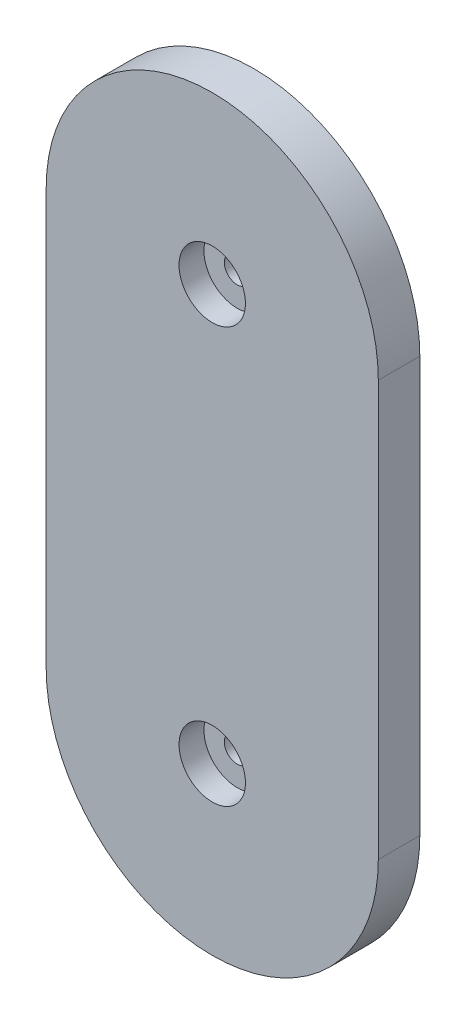
ISO-10303-21;
HEADER;
FILE_DESCRIPTION(('STEP AP214'),'2;1');
FILE_NAME('part.step','',(''),(''),'','','');
FILE_SCHEMA(('AUTOMOTIVE_DESIGN { 1 0 10303 214 1 1 1 1 }'));
ENDSEC;
DATA;
#1=APPLICATION_CONTEXT('core data for automotive mechanical design processes');
#2=APPLICATION_PROTOCOL_DEFINITION('international standard','automotive_design',2000,#1);
#3=PRODUCT_CONTEXT('',#1,'mechanical');
#4=PRODUCT('Part','Part','',(#3));
#5=PRODUCT_RELATED_PRODUCT_CATEGORY('part','',(#4));
#6=PRODUCT_DEFINITION_FORMATION('','',#4);
#7=PRODUCT_DEFINITION_CONTEXT('part definition',#1,'design');
#8=PRODUCT_DEFINITION('design','',#6,#7);
#9=PRODUCT_DEFINITION_SHAPE('','',#8);
#10=(LENGTH_UNIT() NAMED_UNIT(*) SI_UNIT(.MILLI.,.METRE.));
#11=(NAMED_UNIT(*) PLANE_ANGLE_UNIT() SI_UNIT($,.RADIAN.));
#12=(NAMED_UNIT(*) SI_UNIT($,.STERADIAN.) SOLID_ANGLE_UNIT());
#13=UNCERTAINTY_MEASURE_WITH_UNIT(LENGTH_MEASURE(1.E-05),#10,'distance_accuracy_value','');
#14=(GEOMETRIC_REPRESENTATION_CONTEXT(3) GLOBAL_UNCERTAINTY_ASSIGNED_CONTEXT((#13)) GLOBAL_UNIT_ASSIGNED_CONTEXT((#10,
#11,#12)) REPRESENTATION_CONTEXT('',''));
#15=CARTESIAN_POINT('',(0.,0.,0.));
#16=DIRECTION('',(0.,0.,1.));
#17=DIRECTION('',(1.,0.,0.));
#18=AXIS2_PLACEMENT_3D('',#15,#16,#17);
#19=CARTESIAN_POINT('',(0.,0.,5.));
#20=DIRECTION('',(0.,0.,-1.));
#21=DIRECTION('',(-1.,0.,0.));
#22=AXIS2_PLACEMENT_3D('',#19,#20,#21);
#23=CYLINDRICAL_SURFACE('',#22,20.);
#24=CARTESIAN_POINT('',(0.,0.,0.));
#25=DIRECTION('',(0.,0.,1.));
#26=DIRECTION('',(1.,0.,0.));
#27=AXIS2_PLACEMENT_3D('',#24,#25,#26);
#28=CIRCLE('',#27,20.);
#29=CARTESIAN_POINT('',(-20.,0.,0.));
#30=VERTEX_POINT('',#29);
#31=CARTESIAN_POINT('',(20.,0.,0.));
#32=VERTEX_POINT('',#31);
#33=EDGE_CURVE('E102',#30,#32,#28,.T.);
#34=ORIENTED_EDGE('',*,*,#33,.T.);
#35=DIRECTION('',(0.,0.,-1.));
#36=VECTOR('',#35,1.);
#37=CARTESIAN_POINT('',(20.,0.,5.));
#38=LINE('',#37,#36);
#39=CARTESIAN_POINT('',(20.,0.,5.));
#40=VERTEX_POINT('',#39);
#41=EDGE_CURVE('E11',#40,#32,#38,.T.);
#42=ORIENTED_EDGE('',*,*,#41,.F.);
#43=CARTESIAN_POINT('',(0.,0.,5.));
#44=DIRECTION('',(0.,0.,1.));
#45=DIRECTION('',(1.,0.,0.));
#46=AXIS2_PLACEMENT_3D('',#43,#44,#45);
#47=CIRCLE('',#46,20.);
#48=CARTESIAN_POINT('',(-20.,0.,5.));
#49=VERTEX_POINT('',#48);
#50=EDGE_CURVE('E89',#49,#40,#47,.T.);
#51=ORIENTED_EDGE('',*,*,#50,.F.);
#52=DIRECTION('',(0.,0.,-1.));
#53=VECTOR('',#52,1.);
#54=CARTESIAN_POINT('',(-20.,0.,5.));
#55=LINE('',#54,#53);
#56=EDGE_CURVE('E98',#49,#30,#55,.T.);
#57=ORIENTED_EDGE('',*,*,#56,.T.);
#58=EDGE_LOOP('',(#34,#42,#51,#57));
#59=FACE_BOUND('',#58,.T.);
#60=ADVANCED_FACE('F36',(#59),#23,.T.);
#61=CARTESIAN_POINT('',(20.,0.,5.));
#62=DIRECTION('',(-1.,0.,0.));
#63=DIRECTION('',(0.,0.,1.));
#64=AXIS2_PLACEMENT_3D('',#61,#62,#63);
#65=PLANE('',#64);
#66=DIRECTION('',(0.,1.,0.));
#67=VECTOR('',#66,1.);
#68=CARTESIAN_POINT('',(20.,0.,0.));
#69=LINE('',#68,#67);
#70=CARTESIAN_POINT('',(20.,50.,0.));
#71=VERTEX_POINT('',#70);
#72=EDGE_CURVE('E93',#32,#71,#69,.T.);
#73=ORIENTED_EDGE('',*,*,#72,.T.);
#74=DIRECTION('',(0.,0.,-1.));
#75=VECTOR('',#74,1.);
#76=CARTESIAN_POINT('',(20.,50.,5.));
#77=LINE('',#76,#75);
#78=CARTESIAN_POINT('',(20.,50.,5.));
#79=VERTEX_POINT('',#78);
#80=EDGE_CURVE('E45',#79,#71,#77,.T.);
#81=ORIENTED_EDGE('',*,*,#80,.F.);
#82=DIRECTION('',(0.,1.,0.));
#83=VECTOR('',#82,1.);
#84=CARTESIAN_POINT('',(20.,0.,5.));
#85=LINE('',#84,#83);
#86=EDGE_CURVE('E84',#40,#79,#85,.T.);
#87=ORIENTED_EDGE('',*,*,#86,.F.);
#88=ORIENTED_EDGE('',*,*,#41,.T.);
#89=EDGE_LOOP('',(#73,#81,#87,#88));
#90=FACE_BOUND('',#89,.T.);
#91=ADVANCED_FACE('F92',(#90),#65,.F.);
#92=CARTESIAN_POINT('',(0.,50.,5.));
#93=DIRECTION('',(0.,0.,-1.));
#94=DIRECTION('',(-1.,0.,0.));
#95=AXIS2_PLACEMENT_3D('',#92,#93,#94);
#96=CYLINDRICAL_SURFACE('',#95,20.);
#97=CARTESIAN_POINT('',(0.,50.,0.));
#98=DIRECTION('',(0.,0.,1.));
#99=DIRECTION('',(1.,0.,0.));
#100=AXIS2_PLACEMENT_3D('',#97,#98,#99);
#101=CIRCLE('',#100,20.);
#102=CARTESIAN_POINT('',(-20.,50.,0.));
#103=VERTEX_POINT('',#102);
#104=EDGE_CURVE('E71',#71,#103,#101,.T.);
#105=ORIENTED_EDGE('',*,*,#104,.T.);
#106=DIRECTION('',(0.,0.,-1.));
#107=VECTOR('',#106,1.);
#108=CARTESIAN_POINT('',(-20.,50.,5.));
#109=LINE('',#108,#107);
#110=CARTESIAN_POINT('',(-20.,50.,5.));
#111=VERTEX_POINT('',#110);
#112=EDGE_CURVE('E94',#111,#103,#109,.T.);
#113=ORIENTED_EDGE('',*,*,#112,.F.);
#114=CARTESIAN_POINT('',(0.,50.,5.));
#115=DIRECTION('',(0.,0.,1.));
#116=DIRECTION('',(1.,0.,0.));
#117=AXIS2_PLACEMENT_3D('',#114,#115,#116);
#118=CIRCLE('',#117,20.);
#119=EDGE_CURVE('E87',#79,#111,#118,.T.);
#120=ORIENTED_EDGE('',*,*,#119,.F.);
#121=ORIENTED_EDGE('',*,*,#80,.T.);
#122=EDGE_LOOP('',(#105,#113,#120,#121));
#123=FACE_BOUND('',#122,.T.);
#124=ADVANCED_FACE('F96',(#123),#96,.T.);
#125=CARTESIAN_POINT('',(-20.,0.,5.));
#126=DIRECTION('',(1.,0.,0.));
#127=DIRECTION('',(0.,0.,-1.));
#128=AXIS2_PLACEMENT_3D('',#125,#126,#127);
#129=PLANE('',#128);
#130=DIRECTION('',(0.,-1.,0.));
#131=VECTOR('',#130,1.);
#132=CARTESIAN_POINT('',(-20.,0.,0.));
#133=LINE('',#132,#131);
#134=EDGE_CURVE('E77',#103,#30,#133,.T.);
#135=ORIENTED_EDGE('',*,*,#134,.T.);
#136=ORIENTED_EDGE('',*,*,#56,.F.);
#137=DIRECTION('',(0.,-1.,0.));
#138=VECTOR('',#137,1.);
#139=CARTESIAN_POINT('',(-20.,0.,5.));
#140=LINE('',#139,#138);
#141=EDGE_CURVE('E54',#111,#49,#140,.T.);
#142=ORIENTED_EDGE('',*,*,#141,.F.);
#143=ORIENTED_EDGE('',*,*,#112,.T.);
#144=EDGE_LOOP('',(#135,#136,#142,#143));
#145=FACE_BOUND('',#144,.T.);
#146=ADVANCED_FACE('F146',(#145),#129,.F.);
#147=CARTESIAN_POINT('',(0.,0.,5.));
#148=DIRECTION('',(0.,0.,1.));
#149=DIRECTION('',(1.,0.,0.));
#150=AXIS2_PLACEMENT_3D('',#147,#148,#149);
#151=PLANE('',#150);
#152=CARTESIAN_POINT('',(0.,0.,5.));
#153=DIRECTION('',(0.,0.,1.));
#154=DIRECTION('',(1.,0.,0.));
#155=AXIS2_PLACEMENT_3D('',#152,#153,#154);
#156=CIRCLE('',#155,4.);
#157=CARTESIAN_POINT('',(4.,0.,5.));
#158=VERTEX_POINT('',#157);
#159=EDGE_CURVE('E127',#158,#158,#156,.T.);
#160=ORIENTED_EDGE('',*,*,#159,.F.);
#161=EDGE_LOOP('',(#160));
#162=FACE_BOUND('',#161,.T.);
#163=CARTESIAN_POINT('',(0.,50.,5.));
#164=DIRECTION('',(0.,0.,1.));
#165=DIRECTION('',(-1.,0.,0.));
#166=AXIS2_PLACEMENT_3D('',#163,#164,#165);
#167=CIRCLE('',#166,4.);
#168=CARTESIAN_POINT('',(-4.00000000000001,50.,5.));
#169=VERTEX_POINT('',#168);
#170=EDGE_CURVE('E130',#169,#169,#167,.T.);
#171=ORIENTED_EDGE('',*,*,#170,.F.);
#172=EDGE_LOOP('',(#171));
#173=FACE_BOUND('',#172,.T.);
#174=ORIENTED_EDGE('',*,*,#50,.T.);
#175=ORIENTED_EDGE('',*,*,#86,.T.);
#176=ORIENTED_EDGE('',*,*,#119,.T.);
#177=ORIENTED_EDGE('',*,*,#141,.T.);
#178=EDGE_LOOP('',(#174,#175,#176,#177));
#179=FACE_BOUND('',#178,.T.);
#180=ADVANCED_FACE('F85',(#162,#173,#179),#151,.T.);
#181=CARTESIAN_POINT('',(0.,0.,0.));
#182=DIRECTION('',(0.,0.,1.));
#183=DIRECTION('',(1.,0.,0.));
#184=AXIS2_PLACEMENT_3D('',#181,#182,#183);
#185=PLANE('',#184);
#186=CARTESIAN_POINT('',(0.,0.,0.));
#187=DIRECTION('',(0.,0.,1.));
#188=DIRECTION('',(1.,0.,0.));
#189=AXIS2_PLACEMENT_3D('',#186,#187,#188);
#190=CIRCLE('',#189,1.55);
#191=CARTESIAN_POINT('',(1.55,0.,0.));
#192=VERTEX_POINT('',#191);
#193=EDGE_CURVE('E39',#192,#192,#190,.T.);
#194=ORIENTED_EDGE('',*,*,#193,.T.);
#195=EDGE_LOOP('',(#194));
#196=FACE_BOUND('',#195,.T.);
#197=CARTESIAN_POINT('',(0.,50.,0.));
#198=DIRECTION('',(0.,0.,1.));
#199=DIRECTION('',(1.,0.,0.));
#200=AXIS2_PLACEMENT_3D('',#197,#198,#199);
#201=CIRCLE('',#200,1.55);
#202=CARTESIAN_POINT('',(1.55,50.,0.));
#203=VERTEX_POINT('',#202);
#204=EDGE_CURVE('E110',#203,#203,#201,.T.);
#205=ORIENTED_EDGE('',*,*,#204,.T.);
#206=EDGE_LOOP('',(#205));
#207=FACE_BOUND('',#206,.T.);
#208=ORIENTED_EDGE('',*,*,#33,.F.);
#209=ORIENTED_EDGE('',*,*,#134,.F.);
#210=ORIENTED_EDGE('',*,*,#104,.F.);
#211=ORIENTED_EDGE('',*,*,#72,.F.);
#212=EDGE_LOOP('',(#208,#209,#210,#211));
#213=FACE_BOUND('',#212,.T.);
#214=ADVANCED_FACE('F141',(#196,#207,#213),#185,.F.);
#215=CARTESIAN_POINT('',(0.,50.,2.));
#216=DIRECTION('',(0.,0.,1.));
#217=DIRECTION('',(1.,0.,0.));
#218=AXIS2_PLACEMENT_3D('',#215,#216,#217);
#219=CYLINDRICAL_SURFACE('',#218,4.);
#220=CARTESIAN_POINT('',(0.,50.,2.));
#221=DIRECTION('',(0.,0.,1.));
#222=DIRECTION('',(-1.,0.,0.));
#223=AXIS2_PLACEMENT_3D('',#220,#221,#222);
#224=CIRCLE('',#223,4.);
#225=CARTESIAN_POINT('',(-4.00000000000001,50.,2.));
#226=VERTEX_POINT('',#225);
#227=EDGE_CURVE('E116',#226,#226,#224,.T.);
#228=ORIENTED_EDGE('',*,*,#227,.F.);
#229=EDGE_LOOP('',(#228));
#230=FACE_BOUND('',#229,.T.);
#231=ORIENTED_EDGE('',*,*,#170,.T.);
#232=EDGE_LOOP('',(#231));
#233=FACE_BOUND('',#232,.T.);
#234=ADVANCED_FACE('F138',(#230,#233),#219,.F.);
#235=CARTESIAN_POINT('',(0.,50.,2.));
#236=DIRECTION('',(0.,0.,-1.));
#237=DIRECTION('',(-1.,0.,0.));
#238=AXIS2_PLACEMENT_3D('',#235,#236,#237);
#239=PLANE('',#238);
#240=CARTESIAN_POINT('',(0.,50.,2.));
#241=DIRECTION('',(0.,0.,1.));
#242=DIRECTION('',(-1.,0.,0.));
#243=AXIS2_PLACEMENT_3D('',#240,#241,#242);
#244=CIRCLE('',#243,1.55);
#245=CARTESIAN_POINT('',(-1.55,50.,2.));
#246=VERTEX_POINT('',#245);
#247=EDGE_CURVE('E118',#246,#246,#244,.T.);
#248=ORIENTED_EDGE('',*,*,#247,.F.);
#249=EDGE_LOOP('',(#248));
#250=FACE_BOUND('',#249,.T.);
#251=ORIENTED_EDGE('',*,*,#227,.T.);
#252=EDGE_LOOP('',(#251));
#253=FACE_BOUND('',#252,.T.);
#254=ADVANCED_FACE('F136',(#250,#253),#239,.F.);
#255=CARTESIAN_POINT('',(0.,0.,2.));
#256=DIRECTION('',(0.,0.,1.));
#257=DIRECTION('',(1.,0.,0.));
#258=AXIS2_PLACEMENT_3D('',#255,#256,#257);
#259=CYLINDRICAL_SURFACE('',#258,4.);
#260=CARTESIAN_POINT('',(0.,0.,2.));
#261=DIRECTION('',(0.,0.,1.));
#262=DIRECTION('',(1.,0.,0.));
#263=AXIS2_PLACEMENT_3D('',#260,#261,#262);
#264=CIRCLE('',#263,4.);
#265=CARTESIAN_POINT('',(4.,0.,2.));
#266=VERTEX_POINT('',#265);
#267=EDGE_CURVE('E105',#266,#266,#264,.T.);
#268=ORIENTED_EDGE('',*,*,#267,.F.);
#269=EDGE_LOOP('',(#268));
#270=FACE_BOUND('',#269,.T.);
#271=ORIENTED_EDGE('',*,*,#159,.T.);
#272=EDGE_LOOP('',(#271));
#273=FACE_BOUND('',#272,.T.);
#274=ADVANCED_FACE('F196',(#270,#273),#259,.F.);
#275=CARTESIAN_POINT('',(0.,0.,2.));
#276=DIRECTION('',(0.,0.,1.));
#277=DIRECTION('',(1.,0.,0.));
#278=AXIS2_PLACEMENT_3D('',#275,#276,#277);
#279=PLANE('',#278);
#280=CARTESIAN_POINT('',(0.,0.,2.));
#281=DIRECTION('',(0.,0.,1.));
#282=DIRECTION('',(1.,0.,0.));
#283=AXIS2_PLACEMENT_3D('',#280,#281,#282);
#284=CIRCLE('',#283,1.55);
#285=CARTESIAN_POINT('',(1.55,0.,2.));
#286=VERTEX_POINT('',#285);
#287=EDGE_CURVE('E112',#286,#286,#284,.T.);
#288=ORIENTED_EDGE('',*,*,#287,.F.);
#289=EDGE_LOOP('',(#288));
#290=FACE_BOUND('',#289,.T.);
#291=ORIENTED_EDGE('',*,*,#267,.T.);
#292=EDGE_LOOP('',(#291));
#293=FACE_BOUND('',#292,.T.);
#294=ADVANCED_FACE('F201',(#290,#293),#279,.T.);
#295=CARTESIAN_POINT('',(0.,50.,-20.));
#296=DIRECTION('',(0.,0.,1.));
#297=DIRECTION('',(1.,0.,0.));
#298=AXIS2_PLACEMENT_3D('',#295,#296,#297);
#299=CYLINDRICAL_SURFACE('',#298,1.55);
#300=ORIENTED_EDGE('',*,*,#247,.T.);
#301=EDGE_LOOP('',(#300));
#302=FACE_BOUND('',#301,.T.);
#303=ORIENTED_EDGE('',*,*,#204,.F.);
#304=EDGE_LOOP('',(#303));
#305=FACE_BOUND('',#304,.T.);
#306=ADVANCED_FACE('F225',(#302,#305),#299,.F.);
#307=CARTESIAN_POINT('',(0.,0.,-20.));
#308=DIRECTION('',(0.,0.,1.));
#309=DIRECTION('',(1.,0.,0.));
#310=AXIS2_PLACEMENT_3D('',#307,#308,#309);
#311=CYLINDRICAL_SURFACE('',#310,1.55);
#312=ORIENTED_EDGE('',*,*,#287,.T.);
#313=EDGE_LOOP('',(#312));
#314=FACE_BOUND('',#313,.T.);
#315=ORIENTED_EDGE('',*,*,#193,.F.);
#316=EDGE_LOOP('',(#315));
#317=FACE_BOUND('',#316,.T.);
#318=ADVANCED_FACE('F236',(#314,#317),#311,.F.);
#319=CLOSED_SHELL('',(#60,#91,#124,#146,#180,#214,#234,#254,#274,#294,#306,#318));
#320=MANIFOLD_SOLID_BREP('B2',#319);
#321=ADVANCED_BREP_SHAPE_REPRESENTATION('',(#18,#320),#14);
#322=SHAPE_DEFINITION_REPRESENTATION(#9,#321);
ENDSEC;
END-ISO-10303-21;
